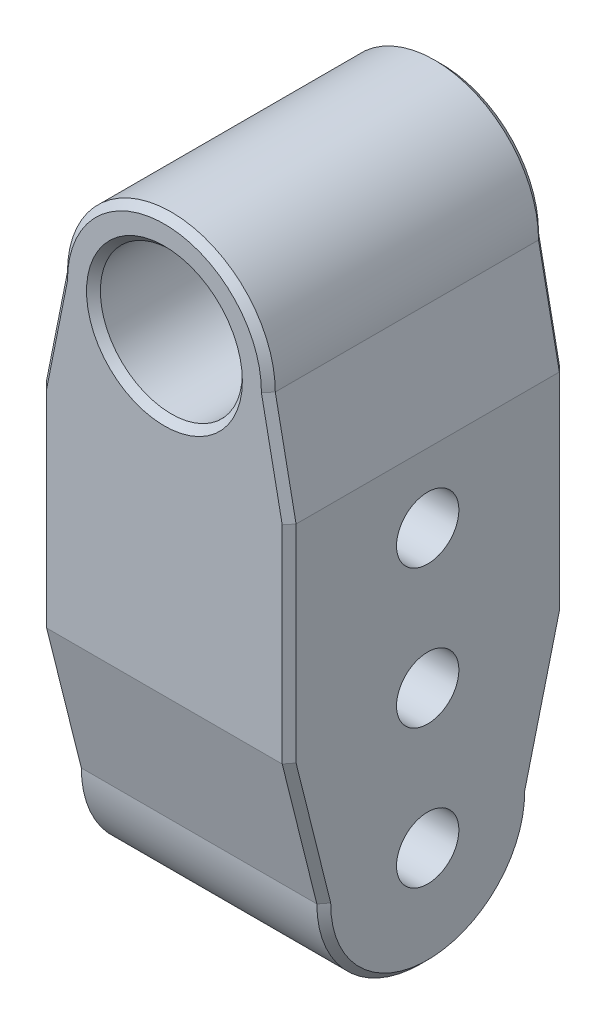
ISO-10303-21;
HEADER;
FILE_DESCRIPTION(('STEP AP214'),'2;1');
FILE_NAME('part.step','',(''),(''),'','','');
FILE_SCHEMA(('AUTOMOTIVE_DESIGN { 1 0 10303 214 1 1 1 1 }'));
ENDSEC;
DATA;
#1=APPLICATION_CONTEXT('core data for automotive mechanical design processes');
#2=APPLICATION_PROTOCOL_DEFINITION('international standard','automotive_design',2000,#1);
#3=PRODUCT_CONTEXT('',#1,'mechanical');
#4=PRODUCT('Part','Part','',(#3));
#5=PRODUCT_RELATED_PRODUCT_CATEGORY('part','',(#4));
#6=PRODUCT_DEFINITION_FORMATION('','',#4);
#7=PRODUCT_DEFINITION_CONTEXT('part definition',#1,'design');
#8=PRODUCT_DEFINITION('design','',#6,#7);
#9=PRODUCT_DEFINITION_SHAPE('','',#8);
#10=(LENGTH_UNIT() NAMED_UNIT(*) SI_UNIT(.MILLI.,.METRE.));
#11=(NAMED_UNIT(*) PLANE_ANGLE_UNIT() SI_UNIT($,.RADIAN.));
#12=(NAMED_UNIT(*) SI_UNIT($,.STERADIAN.) SOLID_ANGLE_UNIT());
#13=UNCERTAINTY_MEASURE_WITH_UNIT(LENGTH_MEASURE(1.E-05),#10,'distance_accuracy_value','');
#14=(GEOMETRIC_REPRESENTATION_CONTEXT(3) GLOBAL_UNCERTAINTY_ASSIGNED_CONTEXT((#13)) GLOBAL_UNIT_ASSIGNED_CONTEXT((#10,
#11,#12)) REPRESENTATION_CONTEXT('',''));
#15=CARTESIAN_POINT('',(0.,0.,0.));
#16=DIRECTION('',(0.,0.,1.));
#17=DIRECTION('',(1.,0.,0.));
#18=AXIS2_PLACEMENT_3D('',#15,#16,#17);
#19=CARTESIAN_POINT('',(18.,-80.,20.));
#20=DIRECTION('',(-1.,0.,0.));
#21=DIRECTION('',(0.,-1.,0.));
#22=AXIS2_PLACEMENT_3D('',#19,#20,#21);
#23=PLANE('',#22);
#24=CARTESIAN_POINT('',(18.,-25.,0.));
#25=DIRECTION('',(-1.,0.,0.));
#26=DIRECTION('',(0.,-1.,0.));
#27=AXIS2_PLACEMENT_3D('',#24,#25,#26);
#28=CIRCLE('',#27,4.5);
#29=CARTESIAN_POINT('',(18.,-29.5,0.));
#30=VERTEX_POINT('',#29);
#31=EDGE_CURVE('E429',#30,#30,#28,.T.);
#32=ORIENTED_EDGE('',*,*,#31,.T.);
#33=EDGE_LOOP('',(#32));
#34=FACE_BOUND('',#33,.T.);
#35=CARTESIAN_POINT('',(18.,-45.,0.));
#36=DIRECTION('',(-1.,0.,0.));
#37=DIRECTION('',(0.,-1.,0.));
#38=AXIS2_PLACEMENT_3D('',#35,#36,#37);
#39=CIRCLE('',#38,4.5);
#40=CARTESIAN_POINT('',(18.,-49.5,0.));
#41=VERTEX_POINT('',#40);
#42=EDGE_CURVE('E425',#41,#41,#39,.T.);
#43=ORIENTED_EDGE('',*,*,#42,.T.);
#44=EDGE_LOOP('',(#43));
#45=FACE_BOUND('',#44,.T.);
#46=CARTESIAN_POINT('',(18.,-65.,0.));
#47=DIRECTION('',(-1.,0.,0.));
#48=DIRECTION('',(0.,-1.,0.));
#49=AXIS2_PLACEMENT_3D('',#46,#47,#48);
#50=CIRCLE('',#49,4.5);
#51=CARTESIAN_POINT('',(18.,-69.5,0.));
#52=VERTEX_POINT('',#51);
#53=EDGE_CURVE('E419',#52,#52,#50,.T.);
#54=ORIENTED_EDGE('',*,*,#53,.T.);
#55=EDGE_LOOP('',(#54));
#56=FACE_BOUND('',#55,.T.);
#57=DIRECTION('',(0.,0.970142500145332,-0.242535625036333));
#58=VECTOR('',#57,1.);
#59=CARTESIAN_POINT('',(18.,-44.7574643749637,-19.0298574998547));
#60=LINE('',#59,#58);
#61=CARTESIAN_POINT('',(18.,-64.8789864532462,-13.999476980284));
#62=VERTEX_POINT('',#61);
#63=CARTESIAN_POINT('',(18.,-44.8768943743823,-19.));
#64=VERTEX_POINT('',#63);
#65=EDGE_CURVE('E54',#62,#64,#60,.T.);
#66=ORIENTED_EDGE('',*,*,#65,.T.);
#67=DIRECTION('',(0.,1.,0.));
#68=VECTOR('',#67,1.);
#69=CARTESIAN_POINT('',(18.,-80.,-19.));
#70=LINE('',#69,#68);
#71=CARTESIAN_POINT('',(18.,-15.,-19.));
#72=VERTEX_POINT('',#71);
#73=EDGE_CURVE('E11',#64,#72,#70,.T.);
#74=ORIENTED_EDGE('',*,*,#73,.T.);
#75=DIRECTION('',(0.,0.,-1.));
#76=VECTOR('',#75,1.);
#77=CARTESIAN_POINT('',(18.,-15.,20.));
#78=LINE('',#77,#76);
#79=CARTESIAN_POINT('',(18.,-15.,19.));
#80=VERTEX_POINT('',#79);
#81=EDGE_CURVE('E168',#80,#72,#78,.T.);
#82=ORIENTED_EDGE('',*,*,#81,.F.);
#83=DIRECTION('',(0.,-1.,0.));
#84=VECTOR('',#83,1.);
#85=CARTESIAN_POINT('',(18.,-45.,19.));
#86=LINE('',#85,#84);
#87=CARTESIAN_POINT('',(18.,-44.8768943743823,19.));
#88=VERTEX_POINT('',#87);
#89=EDGE_CURVE('E215',#80,#88,#86,.T.);
#90=ORIENTED_EDGE('',*,*,#89,.T.);
#91=DIRECTION('',(0.,-0.970142500145332,-0.242535625036333));
#92=VECTOR('',#91,1.);
#93=CARTESIAN_POINT('',(18.,-64.7574643749637,14.0298574998547));
#94=LINE('',#93,#92);
#95=CARTESIAN_POINT('',(18.,-64.8789864532462,13.9994769802841));
#96=VERTEX_POINT('',#95);
#97=EDGE_CURVE('E218',#88,#96,#94,.T.);
#98=ORIENTED_EDGE('',*,*,#97,.T.);
#99=CARTESIAN_POINT('',(18.,-65.,0.));
#100=DIRECTION('',(-1.,0.,0.));
#101=DIRECTION('',(0.,-1.,0.));
#102=AXIS2_PLACEMENT_3D('',#99,#100,#101);
#103=CIRCLE('',#102,14.);
#104=EDGE_CURVE('E65',#96,#62,#103,.F.);
#105=ORIENTED_EDGE('',*,*,#104,.T.);
#106=EDGE_LOOP('',(#66,#74,#82,#90,#98,#105));
#107=FACE_BOUND('',#106,.T.);
#108=ADVANCED_FACE('F43',(#34,#45,#56,#107),#23,.F.);
#109=CARTESIAN_POINT('',(-18.,-80.,20.));
#110=DIRECTION('',(1.,0.,0.));
#111=DIRECTION('',(0.,1.,0.));
#112=AXIS2_PLACEMENT_3D('',#109,#110,#111);
#113=PLANE('',#112);
#114=CARTESIAN_POINT('',(-18.,-25.,0.));
#115=DIRECTION('',(1.,0.,0.));
#116=DIRECTION('',(0.,1.,0.));
#117=AXIS2_PLACEMENT_3D('',#114,#115,#116);
#118=CIRCLE('',#117,4.5);
#119=CARTESIAN_POINT('',(-18.,-20.5,0.));
#120=VERTEX_POINT('',#119);
#121=EDGE_CURVE('E426',#120,#120,#118,.T.);
#122=ORIENTED_EDGE('',*,*,#121,.T.);
#123=EDGE_LOOP('',(#122));
#124=FACE_BOUND('',#123,.T.);
#125=CARTESIAN_POINT('',(-18.,-45.,0.));
#126=DIRECTION('',(1.,0.,0.));
#127=DIRECTION('',(0.,1.,0.));
#128=AXIS2_PLACEMENT_3D('',#125,#126,#127);
#129=CIRCLE('',#128,4.5);
#130=CARTESIAN_POINT('',(-18.,-40.5,0.));
#131=VERTEX_POINT('',#130);
#132=EDGE_CURVE('E421',#131,#131,#129,.T.);
#133=ORIENTED_EDGE('',*,*,#132,.T.);
#134=EDGE_LOOP('',(#133));
#135=FACE_BOUND('',#134,.T.);
#136=CARTESIAN_POINT('',(-18.,-65.,0.));
#137=DIRECTION('',(1.,0.,0.));
#138=DIRECTION('',(0.,1.,0.));
#139=AXIS2_PLACEMENT_3D('',#136,#137,#138);
#140=CIRCLE('',#139,4.5);
#141=CARTESIAN_POINT('',(-18.,-60.5,0.));
#142=VERTEX_POINT('',#141);
#143=EDGE_CURVE('E415',#142,#142,#140,.T.);
#144=ORIENTED_EDGE('',*,*,#143,.T.);
#145=EDGE_LOOP('',(#144));
#146=FACE_BOUND('',#145,.T.);
#147=DIRECTION('',(0.,0.970142500145332,0.242535625036333));
#148=VECTOR('',#147,1.);
#149=CARTESIAN_POINT('',(-18.,-44.7574643749637,19.0298574998547));
#150=LINE('',#149,#148);
#151=CARTESIAN_POINT('',(-18.,-64.8789864532462,13.999476980284));
#152=VERTEX_POINT('',#151);
#153=CARTESIAN_POINT('',(-18.,-44.8768943743823,19.));
#154=VERTEX_POINT('',#153);
#155=EDGE_CURVE('E490',#152,#154,#150,.T.);
#156=ORIENTED_EDGE('',*,*,#155,.T.);
#157=DIRECTION('',(0.,1.,0.));
#158=VECTOR('',#157,1.);
#159=CARTESIAN_POINT('',(-18.,-15.,19.));
#160=LINE('',#159,#158);
#161=CARTESIAN_POINT('',(-18.,-15.,19.));
#162=VERTEX_POINT('',#161);
#163=EDGE_CURVE('E493',#154,#162,#160,.T.);
#164=ORIENTED_EDGE('',*,*,#163,.T.);
#165=DIRECTION('',(0.,0.,-1.));
#166=VECTOR('',#165,1.);
#167=CARTESIAN_POINT('',(-18.,-15.,20.));
#168=LINE('',#167,#166);
#169=CARTESIAN_POINT('',(-18.,-15.,-19.));
#170=VERTEX_POINT('',#169);
#171=EDGE_CURVE('E411',#162,#170,#168,.T.);
#172=ORIENTED_EDGE('',*,*,#171,.T.);
#173=DIRECTION('',(0.,-1.,0.));
#174=VECTOR('',#173,1.);
#175=CARTESIAN_POINT('',(-18.,-80.,-19.));
#176=LINE('',#175,#174);
#177=CARTESIAN_POINT('',(-18.,-44.8768943743824,-19.));
#178=VERTEX_POINT('',#177);
#179=EDGE_CURVE('E481',#170,#178,#176,.T.);
#180=ORIENTED_EDGE('',*,*,#179,.T.);
#181=DIRECTION('',(0.,-0.970142500145332,0.242535625036333));
#182=VECTOR('',#181,1.);
#183=CARTESIAN_POINT('',(-18.,-64.7574643749637,-14.0298574998547));
#184=LINE('',#183,#182);
#185=CARTESIAN_POINT('',(-18.,-64.8789864532462,-13.999476980284));
#186=VERTEX_POINT('',#185);
#187=EDGE_CURVE('E484',#178,#186,#184,.T.);
#188=ORIENTED_EDGE('',*,*,#187,.T.);
#189=CARTESIAN_POINT('',(-18.,-65.,0.));
#190=DIRECTION('',(1.,0.,0.));
#191=DIRECTION('',(0.,1.,0.));
#192=AXIS2_PLACEMENT_3D('',#189,#190,#191);
#193=CIRCLE('',#192,14.);
#194=EDGE_CURVE('E487',#186,#152,#193,.F.);
#195=ORIENTED_EDGE('',*,*,#194,.T.);
#196=EDGE_LOOP('',(#156,#164,#172,#180,#188,#195));
#197=FACE_BOUND('',#196,.T.);
#198=ADVANCED_FACE('F547',(#124,#135,#146,#197),#113,.F.);
#199=CARTESIAN_POINT('',(0.,0.,20.));
#200=DIRECTION('',(0.,0.,1.));
#201=DIRECTION('',(1.,0.,0.));
#202=AXIS2_PLACEMENT_3D('',#199,#200,#201);
#203=PLANE('',#202);
#204=CARTESIAN_POINT('',(0.,0.,20.));
#205=DIRECTION('',(0.,0.,1.));
#206=DIRECTION('',(1.,0.,0.));
#207=AXIS2_PLACEMENT_3D('',#204,#205,#206);
#208=CIRCLE('',#207,11.25);
#209=CARTESIAN_POINT('',(11.25,0.,20.));
#210=VERTEX_POINT('',#209);
#211=EDGE_CURVE('E470',#210,#210,#208,.F.);
#212=ORIENTED_EDGE('',*,*,#211,.T.);
#213=EDGE_LOOP('',(#212));
#214=FACE_BOUND('',#213,.T.);
#215=DIRECTION('',(-0.196116135138184,-0.98058067569092,0.));
#216=VECTOR('',#215,1.);
#217=CARTESIAN_POINT('',(-17.0194193243091,-15.1961161351382,20.));
#218=LINE('',#217,#216);
#219=CARTESIAN_POINT('',(-13.9996616842377,-0.0973279347809829,20.));
#220=VERTEX_POINT('',#219);
#221=CARTESIAN_POINT('',(-17.,-15.0990195135928,20.));
#222=VERTEX_POINT('',#221);
#223=EDGE_CURVE('E463',#220,#222,#218,.T.);
#224=ORIENTED_EDGE('',*,*,#223,.T.);
#225=DIRECTION('',(0.,-1.,0.));
#226=VECTOR('',#225,1.);
#227=CARTESIAN_POINT('',(-17.,-45.,20.));
#228=LINE('',#227,#226);
#229=CARTESIAN_POINT('',(-17.,-45.,20.));
#230=VERTEX_POINT('',#229);
#231=EDGE_CURVE('E467',#222,#230,#228,.T.);
#232=ORIENTED_EDGE('',*,*,#231,.T.);
#233=DIRECTION('',(-1.,0.,0.));
#234=VECTOR('',#233,1.);
#235=CARTESIAN_POINT('',(154.479165076579,-45.,20.));
#236=LINE('',#235,#234);
#237=CARTESIAN_POINT('',(17.,-45.,20.));
#238=VERTEX_POINT('',#237);
#239=EDGE_CURVE('E420',#238,#230,#236,.T.);
#240=ORIENTED_EDGE('',*,*,#239,.F.);
#241=DIRECTION('',(0.,1.,0.));
#242=VECTOR('',#241,1.);
#243=CARTESIAN_POINT('',(17.,-15.,20.));
#244=LINE('',#243,#242);
#245=CARTESIAN_POINT('',(17.,-15.0990195135928,20.));
#246=VERTEX_POINT('',#245);
#247=EDGE_CURVE('E460',#238,#246,#244,.T.);
#248=ORIENTED_EDGE('',*,*,#247,.T.);
#249=DIRECTION('',(-0.196116135138184,0.98058067569092,0.));
#250=VECTOR('',#249,1.);
#251=CARTESIAN_POINT('',(14.0194193243091,-0.196116135138179,20.));
#252=LINE('',#251,#250);
#253=CARTESIAN_POINT('',(13.9996616842377,-0.09732793478099,20.));
#254=VERTEX_POINT('',#253);
#255=EDGE_CURVE('E457',#246,#254,#252,.T.);
#256=ORIENTED_EDGE('',*,*,#255,.T.);
#257=CARTESIAN_POINT('',(0.,0.,20.));
#258=DIRECTION('',(0.,0.,1.));
#259=DIRECTION('',(1.,0.,0.));
#260=AXIS2_PLACEMENT_3D('',#257,#258,#259);
#261=CIRCLE('',#260,14.);
#262=EDGE_CURVE('E454',#254,#220,#261,.T.);
#263=ORIENTED_EDGE('',*,*,#262,.T.);
#264=EDGE_LOOP('',(#224,#232,#240,#248,#256,#263));
#265=FACE_BOUND('',#264,.T.);
#266=ADVANCED_FACE('F527',(#214,#265),#203,.T.);
#267=CARTESIAN_POINT('',(0.,0.,-20.));
#268=DIRECTION('',(0.,0.,1.));
#269=DIRECTION('',(1.,0.,0.));
#270=AXIS2_PLACEMENT_3D('',#267,#268,#269);
#271=PLANE('',#270);
#272=CARTESIAN_POINT('',(0.,0.,-20.));
#273=DIRECTION('',(0.,0.,1.));
#274=DIRECTION('',(1.,0.,0.));
#275=AXIS2_PLACEMENT_3D('',#272,#273,#274);
#276=CIRCLE('',#275,11.25);
#277=CARTESIAN_POINT('',(11.25,0.,-20.));
#278=VERTEX_POINT('',#277);
#279=EDGE_CURVE('E442',#278,#278,#276,.T.);
#280=ORIENTED_EDGE('',*,*,#279,.T.);
#281=EDGE_LOOP('',(#280));
#282=FACE_BOUND('',#281,.T.);
#283=DIRECTION('',(-1.,0.,0.));
#284=VECTOR('',#283,1.);
#285=CARTESIAN_POINT('',(154.479165076579,-45.,-20.));
#286=LINE('',#285,#284);
#287=CARTESIAN_POINT('',(17.,-45.,-20.));
#288=VERTEX_POINT('',#287);
#289=CARTESIAN_POINT('',(-17.,-45.,-20.));
#290=VERTEX_POINT('',#289);
#291=EDGE_CURVE('E159',#288,#290,#286,.T.);
#292=ORIENTED_EDGE('',*,*,#291,.T.);
#293=DIRECTION('',(0.,1.,0.));
#294=VECTOR('',#293,1.);
#295=CARTESIAN_POINT('',(-17.,0.,-20.));
#296=LINE('',#295,#294);
#297=CARTESIAN_POINT('',(-17.,-15.0990195135928,-20.));
#298=VERTEX_POINT('',#297);
#299=EDGE_CURVE('E439',#290,#298,#296,.T.);
#300=ORIENTED_EDGE('',*,*,#299,.T.);
#301=DIRECTION('',(0.196116135138184,0.98058067569092,0.));
#302=VECTOR('',#301,1.);
#303=CARTESIAN_POINT('',(-13.442496247386,2.6884992494772,-20.));
#304=LINE('',#303,#302);
#305=CARTESIAN_POINT('',(-13.9996616842377,-0.0973279347810245,-20.));
#306=VERTEX_POINT('',#305);
#307=EDGE_CURVE('E436',#298,#306,#304,.T.);
#308=ORIENTED_EDGE('',*,*,#307,.T.);
#309=CARTESIAN_POINT('',(0.,0.,-20.));
#310=DIRECTION('',(0.,0.,1.));
#311=DIRECTION('',(1.,0.,0.));
#312=AXIS2_PLACEMENT_3D('',#309,#310,#311);
#313=CIRCLE('',#312,14.);
#314=CARTESIAN_POINT('',(13.9996616842377,-0.0973279347810152,-20.));
#315=VERTEX_POINT('',#314);
#316=EDGE_CURVE('E433',#306,#315,#313,.F.);
#317=ORIENTED_EDGE('',*,*,#316,.T.);
#318=DIRECTION('',(0.196116135138184,-0.98058067569092,0.));
#319=VECTOR('',#318,1.);
#320=CARTESIAN_POINT('',(13.442496247386,2.6884992494772,-20.));
#321=LINE('',#320,#319);
#322=CARTESIAN_POINT('',(17.,-15.0990195135928,-20.));
#323=VERTEX_POINT('',#322);
#324=EDGE_CURVE('E162',#315,#323,#321,.T.);
#325=ORIENTED_EDGE('',*,*,#324,.T.);
#326=DIRECTION('',(0.,-1.,0.));
#327=VECTOR('',#326,1.);
#328=CARTESIAN_POINT('',(17.,0.,-20.));
#329=LINE('',#328,#327);
#330=EDGE_CURVE('E156',#323,#288,#329,.T.);
#331=ORIENTED_EDGE('',*,*,#330,.T.);
#332=EDGE_LOOP('',(#292,#300,#308,#317,#325,#331));
#333=FACE_BOUND('',#332,.T.);
#334=ADVANCED_FACE('F158',(#282,#333),#271,.F.);
#335=CARTESIAN_POINT('',(18.,-15.,20.));
#336=DIRECTION('',(-0.98058067569092,-0.196116135138184,0.));
#337=DIRECTION('',(0.196116135138184,-0.98058067569092,0.));
#338=AXIS2_PLACEMENT_3D('',#335,#336,#337);
#339=PLANE('',#338);
#340=ORIENTED_EDGE('',*,*,#81,.T.);
#341=DIRECTION('',(-0.196116135138184,0.98058067569092,0.));
#342=VECTOR('',#341,1.);
#343=CARTESIAN_POINT('',(18.,-15.,-19.));
#344=LINE('',#343,#342);
#345=CARTESIAN_POINT('',(15.,0.,-19.));
#346=VERTEX_POINT('',#345);
#347=EDGE_CURVE('E212',#72,#346,#344,.T.);
#348=ORIENTED_EDGE('',*,*,#347,.T.);
#349=DIRECTION('',(0.,0.,-1.));
#350=VECTOR('',#349,1.);
#351=CARTESIAN_POINT('',(15.,0.,20.));
#352=LINE('',#351,#350);
#353=CARTESIAN_POINT('',(15.,0.,19.));
#354=VERTEX_POINT('',#353);
#355=EDGE_CURVE('E397',#354,#346,#352,.T.);
#356=ORIENTED_EDGE('',*,*,#355,.F.);
#357=DIRECTION('',(0.196116135138184,-0.98058067569092,0.));
#358=VECTOR('',#357,1.);
#359=CARTESIAN_POINT('',(18.,-15.,19.));
#360=LINE('',#359,#358);
#361=EDGE_CURVE('E209',#354,#80,#360,.T.);
#362=ORIENTED_EDGE('',*,*,#361,.T.);
#363=EDGE_LOOP('',(#340,#348,#356,#362));
#364=FACE_BOUND('',#363,.T.);
#365=ADVANCED_FACE('F396',(#364),#339,.F.);
#366=CARTESIAN_POINT('',(0.,0.,20.));
#367=DIRECTION('',(0.,0.,-1.));
#368=DIRECTION('',(-1.,0.,0.));
#369=AXIS2_PLACEMENT_3D('',#366,#367,#368);
#370=CYLINDRICAL_SURFACE('',#369,15.);
#371=ORIENTED_EDGE('',*,*,#355,.T.);
#372=CARTESIAN_POINT('',(0.,0.,-19.));
#373=DIRECTION('',(0.,0.,1.));
#374=DIRECTION('',(1.,0.,0.));
#375=AXIS2_PLACEMENT_3D('',#372,#373,#374);
#376=CIRCLE('',#375,15.);
#377=CARTESIAN_POINT('',(-15.,0.,-19.));
#378=VERTEX_POINT('',#377);
#379=EDGE_CURVE('E206',#346,#378,#376,.T.);
#380=ORIENTED_EDGE('',*,*,#379,.T.);
#381=DIRECTION('',(0.,0.,-1.));
#382=VECTOR('',#381,1.);
#383=CARTESIAN_POINT('',(-15.,0.,20.));
#384=LINE('',#383,#382);
#385=CARTESIAN_POINT('',(-15.,0.,19.));
#386=VERTEX_POINT('',#385);
#387=EDGE_CURVE('E406',#386,#378,#384,.T.);
#388=ORIENTED_EDGE('',*,*,#387,.F.);
#389=CARTESIAN_POINT('',(0.,0.,19.));
#390=DIRECTION('',(0.,0.,1.));
#391=DIRECTION('',(1.,0.,0.));
#392=AXIS2_PLACEMENT_3D('',#389,#390,#391);
#393=CIRCLE('',#392,15.);
#394=EDGE_CURVE('E198',#386,#354,#393,.F.);
#395=ORIENTED_EDGE('',*,*,#394,.T.);
#396=EDGE_LOOP('',(#371,#380,#388,#395));
#397=FACE_BOUND('',#396,.T.);
#398=ADVANCED_FACE('F401',(#397),#370,.T.);
#399=CARTESIAN_POINT('',(-18.,-15.,20.));
#400=DIRECTION('',(0.98058067569092,-0.196116135138184,0.));
#401=DIRECTION('',(0.196116135138184,0.98058067569092,0.));
#402=AXIS2_PLACEMENT_3D('',#399,#400,#401);
#403=PLANE('',#402);
#404=ORIENTED_EDGE('',*,*,#171,.F.);
#405=DIRECTION('',(0.196116135138184,0.98058067569092,0.));
#406=VECTOR('',#405,1.);
#407=CARTESIAN_POINT('',(-15.,0.,19.));
#408=LINE('',#407,#406);
#409=EDGE_CURVE('E477',#162,#386,#408,.T.);
#410=ORIENTED_EDGE('',*,*,#409,.T.);
#411=ORIENTED_EDGE('',*,*,#387,.T.);
#412=DIRECTION('',(-0.196116135138184,-0.98058067569092,0.));
#413=VECTOR('',#412,1.);
#414=CARTESIAN_POINT('',(-18.,-15.,-19.));
#415=LINE('',#414,#413);
#416=EDGE_CURVE('E474',#378,#170,#415,.T.);
#417=ORIENTED_EDGE('',*,*,#416,.T.);
#418=EDGE_LOOP('',(#404,#410,#411,#417));
#419=FACE_BOUND('',#418,.T.);
#420=ADVANCED_FACE('F574',(#419),#403,.F.);
#421=CARTESIAN_POINT('',(0.,0.,20.));
#422=DIRECTION('',(0.,0.,-1.));
#423=DIRECTION('',(-1.,0.,0.));
#424=AXIS2_PLACEMENT_3D('',#421,#422,#423);
#425=CYLINDRICAL_SURFACE('',#424,10.25);
#426=CARTESIAN_POINT('',(0.,0.,-19.));
#427=DIRECTION('',(0.,0.,1.));
#428=DIRECTION('',(1.,0.,0.));
#429=AXIS2_PLACEMENT_3D('',#426,#427,#428);
#430=CIRCLE('',#429,10.25);
#431=CARTESIAN_POINT('',(10.25,0.,-19.));
#432=VERTEX_POINT('',#431);
#433=EDGE_CURVE('E450',#432,#432,#430,.F.);
#434=ORIENTED_EDGE('',*,*,#433,.T.);
#435=EDGE_LOOP('',(#434));
#436=FACE_BOUND('',#435,.T.);
#437=CARTESIAN_POINT('',(0.,0.,19.));
#438=DIRECTION('',(0.,0.,1.));
#439=DIRECTION('',(1.,0.,0.));
#440=AXIS2_PLACEMENT_3D('',#437,#438,#439);
#441=CIRCLE('',#440,10.25);
#442=CARTESIAN_POINT('',(10.25,0.,19.));
#443=VERTEX_POINT('',#442);
#444=EDGE_CURVE('E446',#443,#443,#441,.T.);
#445=ORIENTED_EDGE('',*,*,#444,.T.);
#446=EDGE_LOOP('',(#445));
#447=FACE_BOUND('',#446,.T.);
#448=ADVANCED_FACE('F577',(#436,#447),#425,.F.);
#449=CARTESIAN_POINT('',(-20.,-65.,0.));
#450=DIRECTION('',(1.,0.,0.));
#451=DIRECTION('',(0.,0.,-1.));
#452=AXIS2_PLACEMENT_3D('',#449,#450,#451);
#453=CYLINDRICAL_SURFACE('',#452,4.5);
#454=ORIENTED_EDGE('',*,*,#143,.F.);
#455=EDGE_LOOP('',(#454));
#456=FACE_BOUND('',#455,.T.);
#457=ORIENTED_EDGE('',*,*,#53,.F.);
#458=EDGE_LOOP('',(#457));
#459=FACE_BOUND('',#458,.T.);
#460=ADVANCED_FACE('F583',(#456,#459),#453,.F.);
#461=CARTESIAN_POINT('',(-20.,-45.,0.));
#462=DIRECTION('',(1.,0.,0.));
#463=DIRECTION('',(0.,0.,-1.));
#464=AXIS2_PLACEMENT_3D('',#461,#462,#463);
#465=CYLINDRICAL_SURFACE('',#464,4.5);
#466=ORIENTED_EDGE('',*,*,#132,.F.);
#467=EDGE_LOOP('',(#466));
#468=FACE_BOUND('',#467,.T.);
#469=ORIENTED_EDGE('',*,*,#42,.F.);
#470=EDGE_LOOP('',(#469));
#471=FACE_BOUND('',#470,.T.);
#472=ADVANCED_FACE('F628',(#468,#471),#465,.F.);
#473=CARTESIAN_POINT('',(-20.,-25.,0.));
#474=DIRECTION('',(1.,0.,0.));
#475=DIRECTION('',(0.,0.,-1.));
#476=AXIS2_PLACEMENT_3D('',#473,#474,#475);
#477=CYLINDRICAL_SURFACE('',#476,4.5);
#478=ORIENTED_EDGE('',*,*,#121,.F.);
#479=EDGE_LOOP('',(#478));
#480=FACE_BOUND('',#479,.T.);
#481=ORIENTED_EDGE('',*,*,#31,.F.);
#482=EDGE_LOOP('',(#481));
#483=FACE_BOUND('',#482,.T.);
#484=ADVANCED_FACE('F632',(#480,#483),#477,.F.);
#485=CARTESIAN_POINT('',(154.479165076579,-45.,20.));
#486=DIRECTION('',(0.,-0.242535625036333,0.970142500145332));
#487=DIRECTION('',(0.,-0.970142500145332,-0.242535625036333));
#488=AXIS2_PLACEMENT_3D('',#485,#486,#487);
#489=PLANE('',#488);
#490=ORIENTED_EDGE('',*,*,#239,.T.);
#491=DIRECTION('',(0.,-0.970142500145332,-0.242535625036333));
#492=VECTOR('',#491,1.);
#493=CARTESIAN_POINT('',(-17.,-65.,15.));
#494=LINE('',#493,#492);
#495=CARTESIAN_POINT('',(-17.,-65.,15.));
#496=VERTEX_POINT('',#495);
#497=EDGE_CURVE('E499',#230,#496,#494,.T.);
#498=ORIENTED_EDGE('',*,*,#497,.T.);
#499=DIRECTION('',(-1.,0.,0.));
#500=VECTOR('',#499,1.);
#501=CARTESIAN_POINT('',(154.479165076579,-65.,15.));
#502=LINE('',#501,#500);
#503=CARTESIAN_POINT('',(17.,-65.,15.));
#504=VERTEX_POINT('',#503);
#505=EDGE_CURVE('E506',#504,#496,#502,.T.);
#506=ORIENTED_EDGE('',*,*,#505,.F.);
#507=DIRECTION('',(0.,0.970142500145332,0.242535625036333));
#508=VECTOR('',#507,1.);
#509=CARTESIAN_POINT('',(17.,-45.,20.));
#510=LINE('',#509,#508);
#511=EDGE_CURVE('E496',#504,#238,#510,.T.);
#512=ORIENTED_EDGE('',*,*,#511,.T.);
#513=EDGE_LOOP('',(#490,#498,#506,#512));
#514=FACE_BOUND('',#513,.T.);
#515=ADVANCED_FACE('F512',(#514),#489,.T.);
#516=CARTESIAN_POINT('',(154.479165076579,-65.,0.));
#517=DIRECTION('',(-1.,0.,0.));
#518=DIRECTION('',(0.,-1.,0.));
#519=AXIS2_PLACEMENT_3D('',#516,#517,#518);
#520=CYLINDRICAL_SURFACE('',#519,15.);
#521=ORIENTED_EDGE('',*,*,#505,.T.);
#522=CARTESIAN_POINT('',(-17.,-65.,0.));
#523=DIRECTION('',(1.,0.,0.));
#524=DIRECTION('',(0.,0.,-1.));
#525=AXIS2_PLACEMENT_3D('',#522,#523,#524);
#526=CIRCLE('',#525,15.);
#527=CARTESIAN_POINT('',(-17.,-65.,-15.));
#528=VERTEX_POINT('',#527);
#529=EDGE_CURVE('E194',#496,#528,#526,.T.);
#530=ORIENTED_EDGE('',*,*,#529,.T.);
#531=DIRECTION('',(-1.,0.,0.));
#532=VECTOR('',#531,1.);
#533=CARTESIAN_POINT('',(154.479165076579,-65.,-15.));
#534=LINE('',#533,#532);
#535=CARTESIAN_POINT('',(17.,-65.,-15.));
#536=VERTEX_POINT('',#535);
#537=EDGE_CURVE('E179',#536,#528,#534,.T.);
#538=ORIENTED_EDGE('',*,*,#537,.F.);
#539=CARTESIAN_POINT('',(17.,-65.,0.));
#540=DIRECTION('',(-1.,0.,0.));
#541=DIRECTION('',(0.,0.,1.));
#542=AXIS2_PLACEMENT_3D('',#539,#540,#541);
#543=CIRCLE('',#542,15.);
#544=EDGE_CURVE('E200',#536,#504,#543,.T.);
#545=ORIENTED_EDGE('',*,*,#544,.T.);
#546=EDGE_LOOP('',(#521,#530,#538,#545));
#547=FACE_BOUND('',#546,.T.);
#548=ADVANCED_FACE('F505',(#547),#520,.T.);
#549=CARTESIAN_POINT('',(154.479165076579,-45.,-20.));
#550=DIRECTION('',(0.,-0.242535625036333,-0.970142500145332));
#551=DIRECTION('',(0.,0.970142500145332,-0.242535625036333));
#552=AXIS2_PLACEMENT_3D('',#549,#550,#551);
#553=PLANE('',#552);
#554=ORIENTED_EDGE('',*,*,#537,.T.);
#555=DIRECTION('',(0.,0.970142500145332,-0.242535625036333));
#556=VECTOR('',#555,1.);
#557=CARTESIAN_POINT('',(-17.,-45.,-20.));
#558=LINE('',#557,#556);
#559=EDGE_CURVE('E177',#528,#290,#558,.T.);
#560=ORIENTED_EDGE('',*,*,#559,.T.);
#561=ORIENTED_EDGE('',*,*,#291,.F.);
#562=DIRECTION('',(0.,-0.970142500145332,0.242535625036333));
#563=VECTOR('',#562,1.);
#564=CARTESIAN_POINT('',(17.,-65.0000000000001,-15.));
#565=LINE('',#564,#563);
#566=EDGE_CURVE('E174',#288,#536,#565,.T.);
#567=ORIENTED_EDGE('',*,*,#566,.T.);
#568=EDGE_LOOP('',(#554,#560,#561,#567));
#569=FACE_BOUND('',#568,.T.);
#570=ADVANCED_FACE('F172',(#569),#553,.T.);
#571=CARTESIAN_POINT('',(0.,0.,-20.));
#572=DIRECTION('',(0.,0.,-1.));
#573=DIRECTION('',(-1.,0.,0.));
#574=AXIS2_PLACEMENT_3D('',#571,#572,#573);
#575=CONICAL_SURFACE('',#574,11.25,0.785398163397446);
#576=ORIENTED_EDGE('',*,*,#433,.F.);
#577=EDGE_LOOP('',(#576));
#578=FACE_BOUND('',#577,.T.);
#579=ORIENTED_EDGE('',*,*,#279,.F.);
#580=EDGE_LOOP('',(#579));
#581=FACE_BOUND('',#580,.T.);
#582=ADVANCED_FACE('F599',(#578,#581),#575,.F.);
#583=CARTESIAN_POINT('',(0.,0.,19.));
#584=DIRECTION('',(0.,0.,1.));
#585=DIRECTION('',(1.,0.,0.));
#586=AXIS2_PLACEMENT_3D('',#583,#584,#585);
#587=CONICAL_SURFACE('',#586,10.25,0.785398163397453);
#588=ORIENTED_EDGE('',*,*,#211,.F.);
#589=EDGE_LOOP('',(#588));
#590=FACE_BOUND('',#589,.T.);
#591=ORIENTED_EDGE('',*,*,#444,.F.);
#592=EDGE_LOOP('',(#591));
#593=FACE_BOUND('',#592,.T.);
#594=ADVANCED_FACE('F604',(#590,#593),#587,.F.);
#595=CARTESIAN_POINT('',(18.,-15.,-19.));
#596=DIRECTION('',(-0.693375245281536,-0.138675049056307,0.707106781186548));
#597=DIRECTION('',(-0.196116135138184,0.98058067569092,0.));
#598=AXIS2_PLACEMENT_3D('',#595,#596,#597);
#599=PLANE('',#598);
#600=CARTESIAN_POINT('',(13.9996616842377,-0.0973279347810167,-20.));
#601=CARTESIAN_POINT('',(14.1664274385752,-0.0813948588162202,-19.8333479906505));
#602=CARTESIAN_POINT('',(14.3331718431529,-0.0653176594935757,-19.6666886515471));
#603=CARTESIAN_POINT('',(14.6666179484059,-0.0328750145590098,-19.3333553182133));
#604=CARTESIAN_POINT('',(14.8333196490823,-0.0165095689546656,-19.1666813239835));
#605=CARTESIAN_POINT('',(15.,0.,-19.));
#606=B_SPLINE_CURVE_WITH_KNOTS('',3,(#600,#601,#602,#603,#604,#605),.UNSPECIFIED.,.F.,.F.,(4,2,
4),(0.,0.708898845363654,1.4177976720921),.UNSPECIFIED.);
#607=EDGE_CURVE('E185',#346,#315,#606,.F.);
#608=ORIENTED_EDGE('',*,*,#607,.F.);
#609=ORIENTED_EDGE('',*,*,#347,.F.);
#610=DIRECTION('',(0.705379856727684,0.0698463703113178,0.705379856727682));
#611=VECTOR('',#610,1.);
#612=CARTESIAN_POINT('',(14.7975655255955,-15.3171035039683,-22.2024344744045));
#613=LINE('',#612,#611);
#614=EDGE_CURVE('E48',#323,#72,#613,.T.);
#615=ORIENTED_EDGE('',*,*,#614,.F.);
#616=ORIENTED_EDGE('',*,*,#324,.F.);
#617=EDGE_LOOP('',(#608,#609,#615,#616));
#618=FACE_BOUND('',#617,.T.);
#619=ADVANCED_FACE('F377',(#618),#599,.F.);
#620=CARTESIAN_POINT('',(18.,-80.,-19.));
#621=DIRECTION('',(-0.707106781186546,0.,0.707106781186549));
#622=DIRECTION('',(0.,1.,0.));
#623=AXIS2_PLACEMENT_3D('',#620,#621,#622);
#624=PLANE('',#623);
#625=ORIENTED_EDGE('',*,*,#614,.T.);
#626=ORIENTED_EDGE('',*,*,#73,.F.);
#627=DIRECTION('',(-0.704442861104866,-0.0867208791282856,-0.704442861104864));
#628=VECTOR('',#627,1.);
#629=CARTESIAN_POINT('',(17.,-45.,-20.));
#630=LINE('',#629,#628);
#631=EDGE_CURVE('E182',#288,#64,#630,.F.);
#632=ORIENTED_EDGE('',*,*,#631,.F.);
#633=ORIENTED_EDGE('',*,*,#330,.F.);
#634=EDGE_LOOP('',(#625,#626,#632,#633));
#635=FACE_BOUND('',#634,.T.);
#636=ADVANCED_FACE('F46',(#635),#624,.F.);
#637=CARTESIAN_POINT('',(0.,0.,-19.));
#638=DIRECTION('',(0.,0.,1.));
#639=DIRECTION('',(1.,0.,0.));
#640=AXIS2_PLACEMENT_3D('',#637,#638,#639);
#641=CONICAL_SURFACE('',#640,15.,0.785398163397446);
#642=ORIENTED_EDGE('',*,*,#607,.T.);
#643=ORIENTED_EDGE('',*,*,#316,.F.);
#644=CARTESIAN_POINT('',(-13.9996616842377,-0.0973279347810245,-20.));
#645=CARTESIAN_POINT('',(-14.1664274385752,-0.0813948588162159,-19.8333479906505));
#646=CARTESIAN_POINT('',(-14.3331718431529,-0.0653176594935646,-19.6666886515471));
#647=CARTESIAN_POINT('',(-14.6666179484059,-0.0328750145589954,-19.3333553182133));
#648=CARTESIAN_POINT('',(-14.8333196490823,-0.0165095689546549,-19.1666813239835));
#649=CARTESIAN_POINT('',(-15.,0.,-19.));
#650=B_SPLINE_CURVE_WITH_KNOTS('',3,(#644,#645,#646,#647,#648,#649),.UNSPECIFIED.,.F.,.F.,(4,2,
4),(0.,0.708898845363653,1.41779767209209),.UNSPECIFIED.);
#651=EDGE_CURVE('E186',#378,#306,#650,.F.);
#652=ORIENTED_EDGE('',*,*,#651,.F.);
#653=ORIENTED_EDGE('',*,*,#379,.F.);
#654=EDGE_LOOP('',(#642,#643,#652,#653));
#655=FACE_BOUND('',#654,.T.);
#656=ADVANCED_FACE('F355',(#655),#641,.T.);
#657=CARTESIAN_POINT('',(17.,-45.,-20.));
#658=DIRECTION('',(0.707106781186556,-0.171498585142507,-0.685994340570027));
#659=DIRECTION('',(0.,0.970142500145332,-0.242535625036333));
#660=AXIS2_PLACEMENT_3D('',#657,#658,#659);
#661=PLANE('',#660);
#662=ORIENTED_EDGE('',*,*,#631,.T.);
#663=ORIENTED_EDGE('',*,*,#65,.F.);
#664=CARTESIAN_POINT('',(17.,-65.,-15.));
#665=CARTESIAN_POINT('',(17.1666893878494,-64.9794735650646,-14.8333121205408));
#666=CARTESIAN_POINT('',(17.333367413405,-64.9591258855697,-14.6665912642056));
#667=CARTESIAN_POINT('',(17.6667007467393,-64.9187880366372,-14.3330835909697));
#668=CARTESIAN_POINT('',(17.8333560545169,-64.8987978672141,-14.1662967740662));
#669=CARTESIAN_POINT('',(18.,-64.8789864532462,-13.9994769802841));
#670=B_SPLINE_CURVE_WITH_KNOTS('',3,(#664,#665,#666,#667,#668,#669),.UNSPECIFIED.,.F.,.F.,(4,2,
4),(0.,0.709875288913377,1.41975060683294),.UNSPECIFIED.);
#671=EDGE_CURVE('E191',#536,#62,#670,.T.);
#672=ORIENTED_EDGE('',*,*,#671,.F.);
#673=ORIENTED_EDGE('',*,*,#566,.F.);
#674=EDGE_LOOP('',(#662,#663,#672,#673));
#675=FACE_BOUND('',#674,.T.);
#676=ADVANCED_FACE('F189',(#675),#661,.T.);
#677=CARTESIAN_POINT('',(-18.,-15.,-19.));
#678=DIRECTION('',(0.693375245281536,-0.138675049056307,0.707106781186548));
#679=DIRECTION('',(-0.196116135138184,-0.98058067569092,0.));
#680=AXIS2_PLACEMENT_3D('',#677,#678,#679);
#681=PLANE('',#680);
#682=ORIENTED_EDGE('',*,*,#651,.T.);
#683=ORIENTED_EDGE('',*,*,#307,.F.);
#684=DIRECTION('',(-0.705379856727685,0.0698463703113133,0.705379856727682));
#685=VECTOR('',#684,1.);
#686=CARTESIAN_POINT('',(-18.,-15.,-19.));
#687=LINE('',#686,#685);
#688=EDGE_CURVE('E327',#170,#298,#687,.F.);
#689=ORIENTED_EDGE('',*,*,#688,.F.);
#690=ORIENTED_EDGE('',*,*,#416,.F.);
#691=EDGE_LOOP('',(#682,#683,#689,#690));
#692=FACE_BOUND('',#691,.T.);
#693=ADVANCED_FACE('F354',(#692),#681,.F.);
#694=CARTESIAN_POINT('',(17.,-65.,0.));
#695=DIRECTION('',(-1.,0.,0.));
#696=DIRECTION('',(0.,0.,1.));
#697=AXIS2_PLACEMENT_3D('',#694,#695,#696);
#698=CONICAL_SURFACE('',#697,15.,0.785398163397451);
#699=ORIENTED_EDGE('',*,*,#671,.T.);
#700=ORIENTED_EDGE('',*,*,#104,.F.);
#701=CARTESIAN_POINT('',(17.,-65.,15.));
#702=CARTESIAN_POINT('',(17.1666893878494,-64.9794735650646,14.8333121205408));
#703=CARTESIAN_POINT('',(17.333367413405,-64.9591258855697,14.6665912642056));
#704=CARTESIAN_POINT('',(17.6667007467393,-64.9187880366372,14.3330835909697));
#705=CARTESIAN_POINT('',(17.8333560545169,-64.8987978672141,14.1662967740662));
#706=CARTESIAN_POINT('',(18.,-64.8789864532462,13.999476980284));
#707=B_SPLINE_CURVE_WITH_KNOTS('',3,(#701,#702,#703,#704,#705,#706),.UNSPECIFIED.,.F.,.F.,(4,2,
4),(0.,0.709875288913381,1.41975060683295),.UNSPECIFIED.);
#708=EDGE_CURVE('E317',#504,#96,#707,.T.);
#709=ORIENTED_EDGE('',*,*,#708,.F.);
#710=ORIENTED_EDGE('',*,*,#544,.F.);
#711=EDGE_LOOP('',(#699,#700,#709,#710));
#712=FACE_BOUND('',#711,.T.);
#713=ADVANCED_FACE('F330',(#712),#698,.T.);
#714=CARTESIAN_POINT('',(-18.,-80.,-19.));
#715=DIRECTION('',(0.707106781186546,0.,0.707106781186549));
#716=DIRECTION('',(0.,-1.,0.));
#717=AXIS2_PLACEMENT_3D('',#714,#715,#716);
#718=PLANE('',#717);
#719=ORIENTED_EDGE('',*,*,#688,.T.);
#720=ORIENTED_EDGE('',*,*,#299,.F.);
#721=DIRECTION('',(0.704442861104871,-0.0867208791282258,-0.704442861104867));
#722=VECTOR('',#721,1.);
#723=CARTESIAN_POINT('',(-15.8543328417516,-45.1410380722658,-21.1456671582484));
#724=LINE('',#723,#722);
#725=EDGE_CURVE('E313',#178,#290,#724,.T.);
#726=ORIENTED_EDGE('',*,*,#725,.F.);
#727=ORIENTED_EDGE('',*,*,#179,.F.);
#728=EDGE_LOOP('',(#719,#720,#726,#727));
#729=FACE_BOUND('',#728,.T.);
#730=ADVANCED_FACE('F340',(#729),#718,.F.);
#731=CARTESIAN_POINT('',(17.,-45.,20.));
#732=DIRECTION('',(0.707106781186554,-0.171498585142507,0.685994340570029));
#733=DIRECTION('',(0.,-0.970142500145332,-0.242535625036333));
#734=AXIS2_PLACEMENT_3D('',#731,#732,#733);
#735=PLANE('',#734);
#736=ORIENTED_EDGE('',*,*,#708,.T.);
#737=ORIENTED_EDGE('',*,*,#97,.F.);
#738=DIRECTION('',(0.704442861104865,0.0867208791282338,-0.704442861104872));
#739=VECTOR('',#738,1.);
#740=CARTESIAN_POINT('',(19.749045689478,-44.6615770105452,17.250954310522));
#741=LINE('',#740,#739);
#742=EDGE_CURVE('E308',#238,#88,#741,.T.);
#743=ORIENTED_EDGE('',*,*,#742,.F.);
#744=ORIENTED_EDGE('',*,*,#511,.F.);
#745=EDGE_LOOP('',(#736,#737,#743,#744));
#746=FACE_BOUND('',#745,.T.);
#747=ADVANCED_FACE('F333',(#746),#735,.T.);
#748=CARTESIAN_POINT('',(-17.,-45.,-20.));
#749=DIRECTION('',(-0.707106781186548,-0.171498585142509,-0.685994340570035));
#750=DIRECTION('',(0.,-0.970142500145332,0.242535625036333));
#751=AXIS2_PLACEMENT_3D('',#748,#749,#750);
#752=PLANE('',#751);
#753=ORIENTED_EDGE('',*,*,#725,.T.);
#754=ORIENTED_EDGE('',*,*,#559,.F.);
#755=CARTESIAN_POINT('',(-17.,-65.,-15.));
#756=CARTESIAN_POINT('',(-17.1666893878493,-64.9794735650646,-14.8333121205408));
#757=CARTESIAN_POINT('',(-17.333367413405,-64.9591258855697,-14.6665912642056));
#758=CARTESIAN_POINT('',(-17.6667007467393,-64.9187880366372,-14.3330835909697));
#759=CARTESIAN_POINT('',(-17.8333560545169,-64.8987978672141,-14.1662967740662));
#760=CARTESIAN_POINT('',(-18.,-64.8789864532462,-13.999476980284));
#761=B_SPLINE_CURVE_WITH_KNOTS('',3,(#755,#756,#757,#758,#759,#760),.UNSPECIFIED.,.F.,.F.,(4,2,
4),(0.,0.709875288913388,1.41975060683296),.UNSPECIFIED.);
#762=EDGE_CURVE('E300',#186,#528,#761,.F.);
#763=ORIENTED_EDGE('',*,*,#762,.F.);
#764=ORIENTED_EDGE('',*,*,#187,.F.);
#765=EDGE_LOOP('',(#753,#754,#763,#764));
#766=FACE_BOUND('',#765,.T.);
#767=ADVANCED_FACE('F295',(#766),#752,.T.);
#768=CARTESIAN_POINT('',(17.,0.,20.));
#769=DIRECTION('',(0.707106781186551,0.,0.707106781186544));
#770=DIRECTION('',(0.,-1.,0.));
#771=AXIS2_PLACEMENT_3D('',#768,#769,#770);
#772=PLANE('',#771);
#773=ORIENTED_EDGE('',*,*,#742,.T.);
#774=ORIENTED_EDGE('',*,*,#89,.F.);
#775=DIRECTION('',(0.705379856727679,0.0698463703113294,-0.705379856727687));
#776=VECTOR('',#775,1.);
#777=CARTESIAN_POINT('',(16.1062852275953,-15.187514715647,20.8937147724047));
#778=LINE('',#777,#776);
#779=EDGE_CURVE('E309',#246,#80,#778,.T.);
#780=ORIENTED_EDGE('',*,*,#779,.F.);
#781=ORIENTED_EDGE('',*,*,#247,.F.);
#782=EDGE_LOOP('',(#773,#774,#780,#781));
#783=FACE_BOUND('',#782,.T.);
#784=ADVANCED_FACE('F293',(#783),#772,.T.);
#785=CARTESIAN_POINT('',(-17.,-65.,0.));
#786=DIRECTION('',(1.,0.,0.));
#787=DIRECTION('',(0.,0.,-1.));
#788=AXIS2_PLACEMENT_3D('',#785,#786,#787);
#789=CONICAL_SURFACE('',#788,15.,0.78539816339745);
#790=ORIENTED_EDGE('',*,*,#762,.T.);
#791=ORIENTED_EDGE('',*,*,#529,.F.);
#792=CARTESIAN_POINT('',(-17.,-65.,15.));
#793=CARTESIAN_POINT('',(-17.1666893878493,-64.9794735650646,14.8333121205408));
#794=CARTESIAN_POINT('',(-17.333367413405,-64.9591258855697,14.6665912642056));
#795=CARTESIAN_POINT('',(-17.6667007467393,-64.9187880366372,14.3330835909697));
#796=CARTESIAN_POINT('',(-17.8333560545169,-64.8987978672141,14.1662967740662));
#797=CARTESIAN_POINT('',(-18.,-64.8789864532462,13.999476980284));
#798=B_SPLINE_CURVE_WITH_KNOTS('',3,(#792,#793,#794,#795,#796,#797),.UNSPECIFIED.,.F.,.F.,(4,2,
4),(0.,0.709875288913382,1.41975060683295),.UNSPECIFIED.);
#799=EDGE_CURVE('E264',#152,#496,#798,.F.);
#800=ORIENTED_EDGE('',*,*,#799,.F.);
#801=ORIENTED_EDGE('',*,*,#194,.F.);
#802=EDGE_LOOP('',(#790,#791,#800,#801));
#803=FACE_BOUND('',#802,.T.);
#804=ADVANCED_FACE('F279',(#803),#789,.T.);
#805=CARTESIAN_POINT('',(13.442496247386,2.6884992494772,20.));
#806=DIRECTION('',(0.69337524528154,0.138675049056308,0.707106781186544));
#807=DIRECTION('',(0.196116135138184,-0.98058067569092,0.));
#808=AXIS2_PLACEMENT_3D('',#805,#806,#807);
#809=PLANE('',#808);
#810=ORIENTED_EDGE('',*,*,#779,.T.);
#811=ORIENTED_EDGE('',*,*,#361,.F.);
#812=CARTESIAN_POINT('',(13.9996616842377,-0.09732793478099,20.));
#813=CARTESIAN_POINT('',(14.1664274385752,-0.0813948588161865,19.8333479906505));
#814=CARTESIAN_POINT('',(14.3331718431529,-0.0653176594935402,19.6666886515471));
#815=CARTESIAN_POINT('',(14.6666179484059,-0.0328750145589812,19.3333553182133));
#816=CARTESIAN_POINT('',(14.8333196490823,-0.0165095689546456,19.1666813239835));
#817=CARTESIAN_POINT('',(15.,0.,19.));
#818=B_SPLINE_CURVE_WITH_KNOTS('',3,(#812,#813,#814,#815,#816,#817),.UNSPECIFIED.,.F.,.F.,(4,2,
4),(0.,0.708898845363651,1.41779767209209),.UNSPECIFIED.);
#819=EDGE_CURVE('E256',#254,#354,#818,.T.);
#820=ORIENTED_EDGE('',*,*,#819,.F.);
#821=ORIENTED_EDGE('',*,*,#255,.F.);
#822=EDGE_LOOP('',(#810,#811,#820,#821));
#823=FACE_BOUND('',#822,.T.);
#824=ADVANCED_FACE('F273',(#823),#809,.T.);
#825=CARTESIAN_POINT('',(-17.,-45.,20.));
#826=DIRECTION('',(-0.707106781186548,-0.171498585142509,0.685994340570035));
#827=DIRECTION('',(0.,0.970142500145332,0.242535625036333));
#828=AXIS2_PLACEMENT_3D('',#825,#826,#827);
#829=PLANE('',#828);
#830=ORIENTED_EDGE('',*,*,#799,.T.);
#831=ORIENTED_EDGE('',*,*,#497,.F.);
#832=DIRECTION('',(-0.704442861104868,0.0867208791281872,-0.704442861104875));
#833=VECTOR('',#832,1.);
#834=CARTESIAN_POINT('',(-17.,-45.,20.));
#835=LINE('',#834,#833);
#836=EDGE_CURVE('E237',#154,#230,#835,.F.);
#837=ORIENTED_EDGE('',*,*,#836,.F.);
#838=ORIENTED_EDGE('',*,*,#155,.F.);
#839=EDGE_LOOP('',(#830,#831,#837,#838));
#840=FACE_BOUND('',#839,.T.);
#841=ADVANCED_FACE('F252',(#840),#829,.T.);
#842=CARTESIAN_POINT('',(0.,0.,20.));
#843=DIRECTION('',(0.,0.,-1.));
#844=DIRECTION('',(-1.,0.,0.));
#845=AXIS2_PLACEMENT_3D('',#842,#843,#844);
#846=CONICAL_SURFACE('',#845,14.,0.785398163397444);
#847=ORIENTED_EDGE('',*,*,#819,.T.);
#848=ORIENTED_EDGE('',*,*,#394,.F.);
#849=CARTESIAN_POINT('',(-15.,0.,19.));
#850=CARTESIAN_POINT('',(-14.8333196490823,-0.0165095689546287,19.1666813239835));
#851=CARTESIAN_POINT('',(-14.6666179484059,-0.0328750145589825,19.3333553182133));
#852=CARTESIAN_POINT('',(-14.3331718431529,-0.0653176594935553,19.6666886515471));
#853=CARTESIAN_POINT('',(-14.1664274385752,-0.081394858816197,19.8333479906505));
#854=CARTESIAN_POINT('',(-13.9996616842377,-0.0973279347809847,20.));
#855=B_SPLINE_CURVE_WITH_KNOTS('',3,(#849,#850,#851,#852,#853,#854),.UNSPECIFIED.,.F.,.F.,(4,2,
4),(0.,0.708898826728441,1.41779767209209),.UNSPECIFIED.);
#856=EDGE_CURVE('E228',#220,#386,#855,.F.);
#857=ORIENTED_EDGE('',*,*,#856,.F.);
#858=ORIENTED_EDGE('',*,*,#262,.F.);
#859=EDGE_LOOP('',(#847,#848,#857,#858));
#860=FACE_BOUND('',#859,.T.);
#861=ADVANCED_FACE('F244',(#860),#846,.T.);
#862=CARTESIAN_POINT('',(-17.,0.,20.));
#863=DIRECTION('',(-0.707106781186551,0.,0.707106781186544));
#864=DIRECTION('',(0.,1.,0.));
#865=AXIS2_PLACEMENT_3D('',#862,#863,#864);
#866=PLANE('',#865);
#867=ORIENTED_EDGE('',*,*,#836,.T.);
#868=ORIENTED_EDGE('',*,*,#231,.F.);
#869=DIRECTION('',(-0.70537985672768,0.0698463703113253,-0.705379856727687));
#870=VECTOR('',#869,1.);
#871=CARTESIAN_POINT('',(-17.743901855693,-15.0253587136813,19.2560981443071));
#872=LINE('',#871,#870);
#873=EDGE_CURVE('E225',#162,#222,#872,.F.);
#874=ORIENTED_EDGE('',*,*,#873,.F.);
#875=ORIENTED_EDGE('',*,*,#163,.F.);
#876=EDGE_LOOP('',(#867,#868,#874,#875));
#877=FACE_BOUND('',#876,.T.);
#878=ADVANCED_FACE('F251',(#877),#866,.T.);
#879=CARTESIAN_POINT('',(-13.442496247386,2.6884992494772,20.));
#880=DIRECTION('',(-0.69337524528154,0.138675049056308,0.707106781186544));
#881=DIRECTION('',(0.196116135138184,0.98058067569092,0.));
#882=AXIS2_PLACEMENT_3D('',#879,#880,#881);
#883=PLANE('',#882);
#884=ORIENTED_EDGE('',*,*,#856,.T.);
#885=ORIENTED_EDGE('',*,*,#409,.F.);
#886=ORIENTED_EDGE('',*,*,#873,.T.);
#887=ORIENTED_EDGE('',*,*,#223,.F.);
#888=EDGE_LOOP('',(#884,#885,#886,#887));
#889=FACE_BOUND('',#888,.T.);
#890=ADVANCED_FACE('F240',(#889),#883,.T.);
#891=CLOSED_SHELL('',(#108,#198,#266,#334,#365,#398,#420,#448,#460,#472,#484,#515,#548,#570,
#582,#594,#619,#636,#656,#676,#693,#713,#730,#747,#767,#784,#804,#824,#841,#861,#878,#890));
#892=MANIFOLD_SOLID_BREP('B2',#891);
#893=ADVANCED_BREP_SHAPE_REPRESENTATION('',(#18,#892),#14);
#894=SHAPE_DEFINITION_REPRESENTATION(#9,#893);
ENDSEC;
END-ISO-10303-21;
